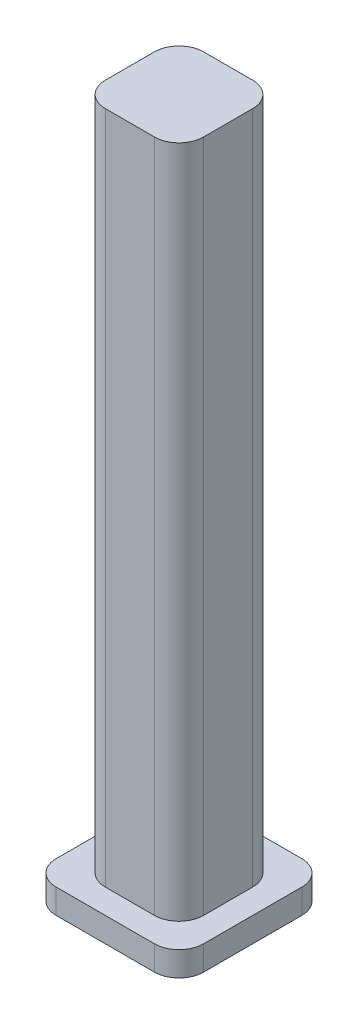
ISO-10303-21;
HEADER;
FILE_DESCRIPTION(('STEP AP214'),'2;1');
FILE_NAME('part.step','',(''),(''),'','','');
FILE_SCHEMA(('AUTOMOTIVE_DESIGN { 1 0 10303 214 1 1 1 1 }'));
ENDSEC;
DATA;
#1=APPLICATION_CONTEXT('core data for automotive mechanical design processes');
#2=APPLICATION_PROTOCOL_DEFINITION('international standard','automotive_design',2000,#1);
#3=PRODUCT_CONTEXT('',#1,'mechanical');
#4=PRODUCT('Part','Part','',(#3));
#5=PRODUCT_RELATED_PRODUCT_CATEGORY('part','',(#4));
#6=PRODUCT_DEFINITION_FORMATION('','',#4);
#7=PRODUCT_DEFINITION_CONTEXT('part definition',#1,'design');
#8=PRODUCT_DEFINITION('design','',#6,#7);
#9=PRODUCT_DEFINITION_SHAPE('','',#8);
#10=(LENGTH_UNIT() NAMED_UNIT(*) SI_UNIT(.MILLI.,.METRE.));
#11=(NAMED_UNIT(*) PLANE_ANGLE_UNIT() SI_UNIT($,.RADIAN.));
#12=(NAMED_UNIT(*) SI_UNIT($,.STERADIAN.) SOLID_ANGLE_UNIT());
#13=UNCERTAINTY_MEASURE_WITH_UNIT(LENGTH_MEASURE(1.E-05),#10,'distance_accuracy_value','');
#14=(GEOMETRIC_REPRESENTATION_CONTEXT(3) GLOBAL_UNCERTAINTY_ASSIGNED_CONTEXT((#13)) GLOBAL_UNIT_ASSIGNED_CONTEXT((#10,
#11,#12)) REPRESENTATION_CONTEXT('',''));
#15=CARTESIAN_POINT('',(0.,0.,0.));
#16=DIRECTION('',(0.,0.,1.));
#17=DIRECTION('',(1.,0.,0.));
#18=AXIS2_PLACEMENT_3D('',#15,#16,#17);
#19=CARTESIAN_POINT('',(0.,10.,0.));
#20=DIRECTION('',(0.,-1.,0.));
#21=DIRECTION('',(0.,0.,-1.));
#22=AXIS2_PLACEMENT_3D('',#19,#20,#21);
#23=PLANE('',#22);
#24=DIRECTION('',(0.,0.,-1.));
#25=VECTOR('',#24,1.);
#26=CARTESIAN_POINT('',(30.,10.,30.));
#27=LINE('',#26,#25);
#28=CARTESIAN_POINT('',(30.,10.,20.));
#29=VERTEX_POINT('',#28);
#30=CARTESIAN_POINT('',(30.,10.,-20.));
#31=VERTEX_POINT('',#30);
#32=EDGE_CURVE('E189',#29,#31,#27,.T.);
#33=ORIENTED_EDGE('',*,*,#32,.T.);
#34=CARTESIAN_POINT('',(20.,10.,-20.));
#35=DIRECTION('',(0.,-1.,0.));
#36=DIRECTION('',(0.,0.,-1.));
#37=AXIS2_PLACEMENT_3D('',#34,#35,#36);
#38=CIRCLE('',#37,10.);
#39=CARTESIAN_POINT('',(20.,10.,-30.));
#40=VERTEX_POINT('',#39);
#41=EDGE_CURVE('E205',#31,#40,#38,.F.);
#42=ORIENTED_EDGE('',*,*,#41,.T.);
#43=DIRECTION('',(-1.,0.,0.));
#44=VECTOR('',#43,1.);
#45=CARTESIAN_POINT('',(-30.,10.,-30.));
#46=LINE('',#45,#44);
#47=CARTESIAN_POINT('',(-20.,10.,-30.));
#48=VERTEX_POINT('',#47);
#49=EDGE_CURVE('E171',#40,#48,#46,.T.);
#50=ORIENTED_EDGE('',*,*,#49,.T.);
#51=CARTESIAN_POINT('',(-20.,10.,-20.));
#52=DIRECTION('',(0.,-1.,0.));
#53=DIRECTION('',(0.,0.,-1.));
#54=AXIS2_PLACEMENT_3D('',#51,#52,#53);
#55=CIRCLE('',#54,10.);
#56=CARTESIAN_POINT('',(-30.,10.,-20.));
#57=VERTEX_POINT('',#56);
#58=EDGE_CURVE('E203',#48,#57,#55,.F.);
#59=ORIENTED_EDGE('',*,*,#58,.T.);
#60=DIRECTION('',(0.,0.,1.));
#61=VECTOR('',#60,1.);
#62=CARTESIAN_POINT('',(-30.,10.,30.));
#63=LINE('',#62,#61);
#64=CARTESIAN_POINT('',(-30.,10.,20.));
#65=VERTEX_POINT('',#64);
#66=EDGE_CURVE('E288',#57,#65,#63,.T.);
#67=ORIENTED_EDGE('',*,*,#66,.T.);
#68=CARTESIAN_POINT('',(-20.,10.,20.));
#69=DIRECTION('',(0.,-1.,0.));
#70=DIRECTION('',(0.,0.,-1.));
#71=AXIS2_PLACEMENT_3D('',#68,#69,#70);
#72=CIRCLE('',#71,10.);
#73=CARTESIAN_POINT('',(-20.,10.,30.));
#74=VERTEX_POINT('',#73);
#75=EDGE_CURVE('E201',#65,#74,#72,.F.);
#76=ORIENTED_EDGE('',*,*,#75,.T.);
#77=DIRECTION('',(1.,0.,0.));
#78=VECTOR('',#77,1.);
#79=CARTESIAN_POINT('',(-30.,10.,30.));
#80=LINE('',#79,#78);
#81=CARTESIAN_POINT('',(20.,10.,30.));
#82=VERTEX_POINT('',#81);
#83=EDGE_CURVE('E190',#74,#82,#80,.T.);
#84=ORIENTED_EDGE('',*,*,#83,.T.);
#85=CARTESIAN_POINT('',(20.,10.,20.));
#86=DIRECTION('',(0.,-1.,0.));
#87=DIRECTION('',(0.,0.,-1.));
#88=AXIS2_PLACEMENT_3D('',#85,#86,#87);
#89=CIRCLE('',#88,10.);
#90=EDGE_CURVE('E199',#82,#29,#89,.F.);
#91=ORIENTED_EDGE('',*,*,#90,.T.);
#92=EDGE_LOOP('',(#33,#42,#50,#59,#67,#76,#84,#91));
#93=FACE_BOUND('',#92,.T.);
#94=DIRECTION('',(0.,0.,-1.));
#95=VECTOR('',#94,1.);
#96=CARTESIAN_POINT('',(20.,10.,0.));
#97=LINE('',#96,#95);
#98=CARTESIAN_POINT('',(20.,10.,10.));
#99=VERTEX_POINT('',#98);
#100=CARTESIAN_POINT('',(20.,10.,-10.));
#101=VERTEX_POINT('',#100);
#102=EDGE_CURVE('E183',#99,#101,#97,.T.);
#103=ORIENTED_EDGE('',*,*,#102,.F.);
#104=CARTESIAN_POINT('',(10.,10.,10.));
#105=DIRECTION('',(0.,-1.,0.));
#106=DIRECTION('',(0.,0.,-1.));
#107=AXIS2_PLACEMENT_3D('',#104,#105,#106);
#108=CIRCLE('',#107,10.);
#109=CARTESIAN_POINT('',(10.,10.,20.));
#110=VERTEX_POINT('',#109);
#111=EDGE_CURVE('E245',#99,#110,#108,.T.);
#112=ORIENTED_EDGE('',*,*,#111,.T.);
#113=DIRECTION('',(1.,0.,0.));
#114=VECTOR('',#113,1.);
#115=CARTESIAN_POINT('',(0.,10.,20.));
#116=LINE('',#115,#114);
#117=CARTESIAN_POINT('',(-10.,10.,20.));
#118=VERTEX_POINT('',#117);
#119=EDGE_CURVE('E275',#118,#110,#116,.T.);
#120=ORIENTED_EDGE('',*,*,#119,.F.);
#121=CARTESIAN_POINT('',(-10.,10.,10.));
#122=DIRECTION('',(0.,-1.,0.));
#123=DIRECTION('',(0.,0.,-1.));
#124=AXIS2_PLACEMENT_3D('',#121,#122,#123);
#125=CIRCLE('',#124,10.);
#126=CARTESIAN_POINT('',(-20.,10.,10.));
#127=VERTEX_POINT('',#126);
#128=EDGE_CURVE('E11',#118,#127,#125,.T.);
#129=ORIENTED_EDGE('',*,*,#128,.T.);
#130=DIRECTION('',(0.,0.,1.));
#131=VECTOR('',#130,1.);
#132=CARTESIAN_POINT('',(-20.,10.,0.));
#133=LINE('',#132,#131);
#134=CARTESIAN_POINT('',(-20.,10.,-9.99999999999999));
#135=VERTEX_POINT('',#134);
#136=EDGE_CURVE('E253',#135,#127,#133,.T.);
#137=ORIENTED_EDGE('',*,*,#136,.F.);
#138=CARTESIAN_POINT('',(-10.,10.,-9.99999999999999));
#139=DIRECTION('',(0.,-1.,0.));
#140=DIRECTION('',(0.,0.,-1.));
#141=AXIS2_PLACEMENT_3D('',#138,#139,#140);
#142=CIRCLE('',#141,10.);
#143=CARTESIAN_POINT('',(-10.,10.,-20.));
#144=VERTEX_POINT('',#143);
#145=EDGE_CURVE('E45',#135,#144,#142,.T.);
#146=ORIENTED_EDGE('',*,*,#145,.T.);
#147=DIRECTION('',(-1.,0.,0.));
#148=VECTOR('',#147,1.);
#149=CARTESIAN_POINT('',(0.,10.,-20.));
#150=LINE('',#149,#148);
#151=CARTESIAN_POINT('',(9.99999999999999,10.,-20.));
#152=VERTEX_POINT('',#151);
#153=EDGE_CURVE('E251',#152,#144,#150,.T.);
#154=ORIENTED_EDGE('',*,*,#153,.F.);
#155=CARTESIAN_POINT('',(9.99999999999999,10.,-10.));
#156=DIRECTION('',(0.,-1.,0.));
#157=DIRECTION('',(0.,0.,-1.));
#158=AXIS2_PLACEMENT_3D('',#155,#156,#157);
#159=CIRCLE('',#158,10.);
#160=EDGE_CURVE('E243',#152,#101,#159,.T.);
#161=ORIENTED_EDGE('',*,*,#160,.T.);
#162=EDGE_LOOP('',(#103,#112,#120,#129,#137,#146,#154,#161));
#163=FACE_BOUND('',#162,.T.);
#164=ADVANCED_FACE('F37',(#93,#163),#23,.F.);
#165=CARTESIAN_POINT('',(30.,10.,30.));
#166=DIRECTION('',(-1.,0.,0.));
#167=DIRECTION('',(0.,0.,1.));
#168=AXIS2_PLACEMENT_3D('',#165,#166,#167);
#169=PLANE('',#168);
#170=DIRECTION('',(0.,0.,-1.));
#171=VECTOR('',#170,1.);
#172=CARTESIAN_POINT('',(30.,0.,30.));
#173=LINE('',#172,#171);
#174=CARTESIAN_POINT('',(30.,0.,20.));
#175=VERTEX_POINT('',#174);
#176=CARTESIAN_POINT('',(30.,0.,-20.));
#177=VERTEX_POINT('',#176);
#178=EDGE_CURVE('E178',#175,#177,#173,.T.);
#179=ORIENTED_EDGE('',*,*,#178,.T.);
#180=DIRECTION('',(0.,-1.,0.));
#181=VECTOR('',#180,1.);
#182=CARTESIAN_POINT('',(30.,10.,-20.));
#183=LINE('',#182,#181);
#184=EDGE_CURVE('E156',#177,#31,#183,.F.);
#185=ORIENTED_EDGE('',*,*,#184,.T.);
#186=ORIENTED_EDGE('',*,*,#32,.F.);
#187=DIRECTION('',(0.,-1.,0.));
#188=VECTOR('',#187,1.);
#189=CARTESIAN_POINT('',(30.,10.,20.));
#190=LINE('',#189,#188);
#191=EDGE_CURVE('E161',#29,#175,#190,.T.);
#192=ORIENTED_EDGE('',*,*,#191,.T.);
#193=EDGE_LOOP('',(#179,#185,#186,#192));
#194=FACE_BOUND('',#193,.T.);
#195=ADVANCED_FACE('F303',(#194),#169,.F.);
#196=CARTESIAN_POINT('',(-30.,10.,-30.));
#197=DIRECTION('',(0.,0.,1.));
#198=DIRECTION('',(1.,0.,0.));
#199=AXIS2_PLACEMENT_3D('',#196,#197,#198);
#200=PLANE('',#199);
#201=ORIENTED_EDGE('',*,*,#49,.F.);
#202=DIRECTION('',(0.,-1.,0.));
#203=VECTOR('',#202,1.);
#204=CARTESIAN_POINT('',(20.,10.,-30.));
#205=LINE('',#204,#203);
#206=CARTESIAN_POINT('',(20.,0.,-30.));
#207=VERTEX_POINT('',#206);
#208=EDGE_CURVE('E155',#40,#207,#205,.T.);
#209=ORIENTED_EDGE('',*,*,#208,.T.);
#210=DIRECTION('',(-1.,0.,0.));
#211=VECTOR('',#210,1.);
#212=CARTESIAN_POINT('',(-30.,0.,-30.));
#213=LINE('',#212,#211);
#214=CARTESIAN_POINT('',(-20.,0.,-30.));
#215=VERTEX_POINT('',#214);
#216=EDGE_CURVE('E168',#207,#215,#213,.T.);
#217=ORIENTED_EDGE('',*,*,#216,.T.);
#218=DIRECTION('',(0.,-1.,0.));
#219=VECTOR('',#218,1.);
#220=CARTESIAN_POINT('',(-20.,10.,-30.));
#221=LINE('',#220,#219);
#222=EDGE_CURVE('E173',#215,#48,#221,.F.);
#223=ORIENTED_EDGE('',*,*,#222,.T.);
#224=EDGE_LOOP('',(#201,#209,#217,#223));
#225=FACE_BOUND('',#224,.T.);
#226=ADVANCED_FACE('F167',(#225),#200,.F.);
#227=CARTESIAN_POINT('',(-30.,10.,30.));
#228=DIRECTION('',(1.,0.,0.));
#229=DIRECTION('',(0.,0.,-1.));
#230=AXIS2_PLACEMENT_3D('',#227,#228,#229);
#231=PLANE('',#230);
#232=ORIENTED_EDGE('',*,*,#66,.F.);
#233=DIRECTION('',(0.,-1.,0.));
#234=VECTOR('',#233,1.);
#235=CARTESIAN_POINT('',(-30.,10.,-20.));
#236=LINE('',#235,#234);
#237=CARTESIAN_POINT('',(-30.,0.,-20.));
#238=VERTEX_POINT('',#237);
#239=EDGE_CURVE('E209',#57,#238,#236,.T.);
#240=ORIENTED_EDGE('',*,*,#239,.T.);
#241=DIRECTION('',(0.,0.,1.));
#242=VECTOR('',#241,1.);
#243=CARTESIAN_POINT('',(-30.,0.,30.));
#244=LINE('',#243,#242);
#245=CARTESIAN_POINT('',(-30.,0.,20.));
#246=VERTEX_POINT('',#245);
#247=EDGE_CURVE('E177',#238,#246,#244,.T.);
#248=ORIENTED_EDGE('',*,*,#247,.T.);
#249=DIRECTION('',(0.,-1.,0.));
#250=VECTOR('',#249,1.);
#251=CARTESIAN_POINT('',(-30.,10.,20.));
#252=LINE('',#251,#250);
#253=EDGE_CURVE('E207',#246,#65,#252,.F.);
#254=ORIENTED_EDGE('',*,*,#253,.T.);
#255=EDGE_LOOP('',(#232,#240,#248,#254));
#256=FACE_BOUND('',#255,.T.);
#257=ADVANCED_FACE('F311',(#256),#231,.F.);
#258=CARTESIAN_POINT('',(-30.,10.,30.));
#259=DIRECTION('',(0.,0.,-1.));
#260=DIRECTION('',(-1.,0.,0.));
#261=AXIS2_PLACEMENT_3D('',#258,#259,#260);
#262=PLANE('',#261);
#263=ORIENTED_EDGE('',*,*,#83,.F.);
#264=DIRECTION('',(0.,-1.,0.));
#265=VECTOR('',#264,1.);
#266=CARTESIAN_POINT('',(-20.,10.,30.));
#267=LINE('',#266,#265);
#268=CARTESIAN_POINT('',(-20.,0.,30.));
#269=VERTEX_POINT('',#268);
#270=EDGE_CURVE('E214',#74,#269,#267,.T.);
#271=ORIENTED_EDGE('',*,*,#270,.T.);
#272=DIRECTION('',(1.,0.,0.));
#273=VECTOR('',#272,1.);
#274=CARTESIAN_POINT('',(-30.,0.,30.));
#275=LINE('',#274,#273);
#276=CARTESIAN_POINT('',(20.,0.,30.));
#277=VERTEX_POINT('',#276);
#278=EDGE_CURVE('E181',#269,#277,#275,.T.);
#279=ORIENTED_EDGE('',*,*,#278,.T.);
#280=DIRECTION('',(0.,-1.,0.));
#281=VECTOR('',#280,1.);
#282=CARTESIAN_POINT('',(20.,10.,30.));
#283=LINE('',#282,#281);
#284=EDGE_CURVE('E212',#277,#82,#283,.F.);
#285=ORIENTED_EDGE('',*,*,#284,.T.);
#286=EDGE_LOOP('',(#263,#271,#279,#285));
#287=FACE_BOUND('',#286,.T.);
#288=ADVANCED_FACE('F305',(#287),#262,.F.);
#289=CARTESIAN_POINT('',(0.,0.,0.));
#290=DIRECTION('',(0.,-1.,0.));
#291=DIRECTION('',(0.,0.,-1.));
#292=AXIS2_PLACEMENT_3D('',#289,#290,#291);
#293=PLANE('',#292);
#294=ORIENTED_EDGE('',*,*,#216,.F.);
#295=CARTESIAN_POINT('',(20.,0.,-20.));
#296=DIRECTION('',(0.,-1.,0.));
#297=DIRECTION('',(0.,0.,-1.));
#298=AXIS2_PLACEMENT_3D('',#295,#296,#297);
#299=CIRCLE('',#298,10.);
#300=EDGE_CURVE('E151',#207,#177,#299,.T.);
#301=ORIENTED_EDGE('',*,*,#300,.T.);
#302=ORIENTED_EDGE('',*,*,#178,.F.);
#303=CARTESIAN_POINT('',(20.,0.,20.));
#304=DIRECTION('',(0.,-1.,0.));
#305=DIRECTION('',(0.,0.,-1.));
#306=AXIS2_PLACEMENT_3D('',#303,#304,#305);
#307=CIRCLE('',#306,10.);
#308=EDGE_CURVE('E172',#175,#277,#307,.T.);
#309=ORIENTED_EDGE('',*,*,#308,.T.);
#310=ORIENTED_EDGE('',*,*,#278,.F.);
#311=CARTESIAN_POINT('',(-20.,0.,20.));
#312=DIRECTION('',(0.,-1.,0.));
#313=DIRECTION('',(0.,0.,-1.));
#314=AXIS2_PLACEMENT_3D('',#311,#312,#313);
#315=CIRCLE('',#314,10.);
#316=EDGE_CURVE('E193',#269,#246,#315,.T.);
#317=ORIENTED_EDGE('',*,*,#316,.T.);
#318=ORIENTED_EDGE('',*,*,#247,.F.);
#319=CARTESIAN_POINT('',(-20.,0.,-20.));
#320=DIRECTION('',(0.,-1.,0.));
#321=DIRECTION('',(0.,0.,-1.));
#322=AXIS2_PLACEMENT_3D('',#319,#320,#321);
#323=CIRCLE('',#322,10.);
#324=EDGE_CURVE('E162',#238,#215,#323,.T.);
#325=ORIENTED_EDGE('',*,*,#324,.T.);
#326=EDGE_LOOP('',(#294,#301,#302,#309,#310,#317,#318,#325));
#327=FACE_BOUND('',#326,.T.);
#328=ADVANCED_FACE('F175',(#327),#293,.T.);
#329=CARTESIAN_POINT('',(20.,284.35549,20.));
#330=DIRECTION('',(-1.,0.,0.));
#331=DIRECTION('',(0.,0.,1.));
#332=AXIS2_PLACEMENT_3D('',#329,#330,#331);
#333=PLANE('',#332);
#334=ORIENTED_EDGE('',*,*,#102,.T.);
#335=DIRECTION('',(0.,-1.,0.));
#336=VECTOR('',#335,1.);
#337=CARTESIAN_POINT('',(20.,284.35549,-9.99999999999999));
#338=LINE('',#337,#336);
#339=CARTESIAN_POINT('',(20.,284.35549,-9.99999999999999));
#340=VERTEX_POINT('',#339);
#341=EDGE_CURVE('E225',#101,#340,#338,.F.);
#342=ORIENTED_EDGE('',*,*,#341,.T.);
#343=DIRECTION('',(0.,0.,-1.));
#344=VECTOR('',#343,1.);
#345=CARTESIAN_POINT('',(20.,284.35549,20.));
#346=LINE('',#345,#344);
#347=CARTESIAN_POINT('',(20.,284.35549,10.));
#348=VERTEX_POINT('',#347);
#349=EDGE_CURVE('E277',#348,#340,#346,.T.);
#350=ORIENTED_EDGE('',*,*,#349,.F.);
#351=DIRECTION('',(0.,-1.,0.));
#352=VECTOR('',#351,1.);
#353=CARTESIAN_POINT('',(20.,284.35549,10.));
#354=LINE('',#353,#352);
#355=EDGE_CURVE('E222',#348,#99,#354,.T.);
#356=ORIENTED_EDGE('',*,*,#355,.T.);
#357=EDGE_LOOP('',(#334,#342,#350,#356));
#358=FACE_BOUND('',#357,.T.);
#359=ADVANCED_FACE('F332',(#358),#333,.F.);
#360=CARTESIAN_POINT('',(-20.,284.35549,-20.));
#361=DIRECTION('',(0.,0.,1.));
#362=DIRECTION('',(1.,0.,0.));
#363=AXIS2_PLACEMENT_3D('',#360,#361,#362);
#364=PLANE('',#363);
#365=DIRECTION('',(-1.,0.,0.));
#366=VECTOR('',#365,1.);
#367=CARTESIAN_POINT('',(-20.,284.35549,-20.));
#368=LINE('',#367,#366);
#369=CARTESIAN_POINT('',(9.99999999999999,284.35549,-20.));
#370=VERTEX_POINT('',#369);
#371=CARTESIAN_POINT('',(-10.,284.35549,-20.));
#372=VERTEX_POINT('',#371);
#373=EDGE_CURVE('E269',#370,#372,#368,.T.);
#374=ORIENTED_EDGE('',*,*,#373,.F.);
#375=DIRECTION('',(0.,-1.,0.));
#376=VECTOR('',#375,1.);
#377=CARTESIAN_POINT('',(9.99999999999999,284.35549,-20.));
#378=LINE('',#377,#376);
#379=EDGE_CURVE('E219',#370,#152,#378,.T.);
#380=ORIENTED_EDGE('',*,*,#379,.T.);
#381=ORIENTED_EDGE('',*,*,#153,.T.);
#382=DIRECTION('',(0.,-1.,0.));
#383=VECTOR('',#382,1.);
#384=CARTESIAN_POINT('',(-10.,284.35549,-20.));
#385=LINE('',#384,#383);
#386=EDGE_CURVE('E217',#144,#372,#385,.F.);
#387=ORIENTED_EDGE('',*,*,#386,.T.);
#388=EDGE_LOOP('',(#374,#380,#381,#387));
#389=FACE_BOUND('',#388,.T.);
#390=ADVANCED_FACE('F259',(#389),#364,.F.);
#391=CARTESIAN_POINT('',(-20.,284.35549,20.));
#392=DIRECTION('',(1.,0.,0.));
#393=DIRECTION('',(0.,0.,-1.));
#394=AXIS2_PLACEMENT_3D('',#391,#392,#393);
#395=PLANE('',#394);
#396=DIRECTION('',(0.,0.,1.));
#397=VECTOR('',#396,1.);
#398=CARTESIAN_POINT('',(-20.,284.35549,20.));
#399=LINE('',#398,#397);
#400=CARTESIAN_POINT('',(-20.,284.35549,-9.99999999999999));
#401=VERTEX_POINT('',#400);
#402=CARTESIAN_POINT('',(-20.,284.35549,10.));
#403=VERTEX_POINT('',#402);
#404=EDGE_CURVE('E268',#401,#403,#399,.T.);
#405=ORIENTED_EDGE('',*,*,#404,.F.);
#406=DIRECTION('',(0.,-1.,0.));
#407=VECTOR('',#406,1.);
#408=CARTESIAN_POINT('',(-20.,284.35549,-9.99999999999999));
#409=LINE('',#408,#407);
#410=EDGE_CURVE('E240',#401,#135,#409,.T.);
#411=ORIENTED_EDGE('',*,*,#410,.T.);
#412=ORIENTED_EDGE('',*,*,#136,.T.);
#413=DIRECTION('',(0.,-1.,0.));
#414=VECTOR('',#413,1.);
#415=CARTESIAN_POINT('',(-20.,284.35549,10.));
#416=LINE('',#415,#414);
#417=EDGE_CURVE('E238',#127,#403,#416,.F.);
#418=ORIENTED_EDGE('',*,*,#417,.T.);
#419=EDGE_LOOP('',(#405,#411,#412,#418));
#420=FACE_BOUND('',#419,.T.);
#421=ADVANCED_FACE('F271',(#420),#395,.F.);
#422=CARTESIAN_POINT('',(-20.,284.35549,20.));
#423=DIRECTION('',(0.,0.,-1.));
#424=DIRECTION('',(-1.,0.,0.));
#425=AXIS2_PLACEMENT_3D('',#422,#423,#424);
#426=PLANE('',#425);
#427=ORIENTED_EDGE('',*,*,#119,.T.);
#428=DIRECTION('',(0.,-1.,0.));
#429=VECTOR('',#428,1.);
#430=CARTESIAN_POINT('',(9.99999999999999,284.35549,20.));
#431=LINE('',#430,#429);
#432=CARTESIAN_POINT('',(9.99999999999999,284.35549,20.));
#433=VERTEX_POINT('',#432);
#434=EDGE_CURVE('E52',#110,#433,#431,.F.);
#435=ORIENTED_EDGE('',*,*,#434,.T.);
#436=DIRECTION('',(1.,0.,0.));
#437=VECTOR('',#436,1.);
#438=CARTESIAN_POINT('',(-20.,284.35549,20.));
#439=LINE('',#438,#437);
#440=CARTESIAN_POINT('',(-10.,284.35549,20.));
#441=VERTEX_POINT('',#440);
#442=EDGE_CURVE('E273',#441,#433,#439,.T.);
#443=ORIENTED_EDGE('',*,*,#442,.F.);
#444=DIRECTION('',(0.,-1.,0.));
#445=VECTOR('',#444,1.);
#446=CARTESIAN_POINT('',(-10.,284.35549,20.));
#447=LINE('',#446,#445);
#448=EDGE_CURVE('E234',#441,#118,#447,.T.);
#449=ORIENTED_EDGE('',*,*,#448,.T.);
#450=EDGE_LOOP('',(#427,#435,#443,#449));
#451=FACE_BOUND('',#450,.T.);
#452=ADVANCED_FACE('F374',(#451),#426,.F.);
#453=CARTESIAN_POINT('',(0.,284.35549,0.));
#454=DIRECTION('',(0.,-1.,0.));
#455=DIRECTION('',(0.,0.,-1.));
#456=AXIS2_PLACEMENT_3D('',#453,#454,#455);
#457=PLANE('',#456);
#458=ORIENTED_EDGE('',*,*,#349,.T.);
#459=CARTESIAN_POINT('',(9.99999999999999,284.35549,-10.));
#460=DIRECTION('',(0.,-1.,0.));
#461=DIRECTION('',(0.,0.,-1.));
#462=AXIS2_PLACEMENT_3D('',#459,#460,#461);
#463=CIRCLE('',#462,10.);
#464=EDGE_CURVE('E232',#340,#370,#463,.F.);
#465=ORIENTED_EDGE('',*,*,#464,.T.);
#466=ORIENTED_EDGE('',*,*,#373,.T.);
#467=CARTESIAN_POINT('',(-10.,284.35549,-9.99999999999999));
#468=DIRECTION('',(0.,-1.,0.));
#469=DIRECTION('',(0.,0.,-1.));
#470=AXIS2_PLACEMENT_3D('',#467,#468,#469);
#471=CIRCLE('',#470,10.);
#472=EDGE_CURVE('E228',#372,#401,#471,.F.);
#473=ORIENTED_EDGE('',*,*,#472,.T.);
#474=ORIENTED_EDGE('',*,*,#404,.T.);
#475=CARTESIAN_POINT('',(-10.,284.35549,10.));
#476=DIRECTION('',(0.,-1.,0.));
#477=DIRECTION('',(0.,0.,-1.));
#478=AXIS2_PLACEMENT_3D('',#475,#476,#477);
#479=CIRCLE('',#478,10.);
#480=EDGE_CURVE('E59',#403,#441,#479,.F.);
#481=ORIENTED_EDGE('',*,*,#480,.T.);
#482=ORIENTED_EDGE('',*,*,#442,.T.);
#483=CARTESIAN_POINT('',(10.,284.35549,10.));
#484=DIRECTION('',(0.,-1.,0.));
#485=DIRECTION('',(0.,0.,-1.));
#486=AXIS2_PLACEMENT_3D('',#483,#484,#485);
#487=CIRCLE('',#486,10.);
#488=EDGE_CURVE('E230',#433,#348,#487,.F.);
#489=ORIENTED_EDGE('',*,*,#488,.T.);
#490=EDGE_LOOP('',(#458,#465,#466,#473,#474,#481,#482,#489));
#491=FACE_BOUND('',#490,.T.);
#492=ADVANCED_FACE('F267',(#491),#457,.F.);
#493=CARTESIAN_POINT('',(20.,10.,-20.));
#494=DIRECTION('',(0.,-1.,0.));
#495=DIRECTION('',(0.,0.,-1.));
#496=AXIS2_PLACEMENT_3D('',#493,#494,#495);
#497=CYLINDRICAL_SURFACE('',#496,10.);
#498=ORIENTED_EDGE('',*,*,#41,.F.);
#499=ORIENTED_EDGE('',*,*,#184,.F.);
#500=ORIENTED_EDGE('',*,*,#300,.F.);
#501=ORIENTED_EDGE('',*,*,#208,.F.);
#502=EDGE_LOOP('',(#498,#499,#500,#501));
#503=FACE_BOUND('',#502,.T.);
#504=ADVANCED_FACE('F154',(#503),#497,.T.);
#505=CARTESIAN_POINT('',(-20.,10.,-20.));
#506=DIRECTION('',(0.,-1.,0.));
#507=DIRECTION('',(0.,0.,-1.));
#508=AXIS2_PLACEMENT_3D('',#505,#506,#507);
#509=CYLINDRICAL_SURFACE('',#508,10.);
#510=ORIENTED_EDGE('',*,*,#58,.F.);
#511=ORIENTED_EDGE('',*,*,#222,.F.);
#512=ORIENTED_EDGE('',*,*,#324,.F.);
#513=ORIENTED_EDGE('',*,*,#239,.F.);
#514=EDGE_LOOP('',(#510,#511,#512,#513));
#515=FACE_BOUND('',#514,.T.);
#516=ADVANCED_FACE('F315',(#515),#509,.T.);
#517=CARTESIAN_POINT('',(-20.,10.,20.));
#518=DIRECTION('',(0.,-1.,0.));
#519=DIRECTION('',(0.,0.,-1.));
#520=AXIS2_PLACEMENT_3D('',#517,#518,#519);
#521=CYLINDRICAL_SURFACE('',#520,10.);
#522=ORIENTED_EDGE('',*,*,#75,.F.);
#523=ORIENTED_EDGE('',*,*,#253,.F.);
#524=ORIENTED_EDGE('',*,*,#316,.F.);
#525=ORIENTED_EDGE('',*,*,#270,.F.);
#526=EDGE_LOOP('',(#522,#523,#524,#525));
#527=FACE_BOUND('',#526,.T.);
#528=ADVANCED_FACE('F307',(#527),#521,.T.);
#529=CARTESIAN_POINT('',(20.,10.,20.));
#530=DIRECTION('',(0.,-1.,0.));
#531=DIRECTION('',(0.,0.,-1.));
#532=AXIS2_PLACEMENT_3D('',#529,#530,#531);
#533=CYLINDRICAL_SURFACE('',#532,10.);
#534=ORIENTED_EDGE('',*,*,#90,.F.);
#535=ORIENTED_EDGE('',*,*,#284,.F.);
#536=ORIENTED_EDGE('',*,*,#308,.F.);
#537=ORIENTED_EDGE('',*,*,#191,.F.);
#538=EDGE_LOOP('',(#534,#535,#536,#537));
#539=FACE_BOUND('',#538,.T.);
#540=ADVANCED_FACE('F301',(#539),#533,.T.);
#541=CARTESIAN_POINT('',(9.99999999999999,284.35549,-10.));
#542=DIRECTION('',(0.,-1.,0.));
#543=DIRECTION('',(0.,0.,-1.));
#544=AXIS2_PLACEMENT_3D('',#541,#542,#543);
#545=CYLINDRICAL_SURFACE('',#544,10.);
#546=ORIENTED_EDGE('',*,*,#464,.F.);
#547=ORIENTED_EDGE('',*,*,#341,.F.);
#548=ORIENTED_EDGE('',*,*,#160,.F.);
#549=ORIENTED_EDGE('',*,*,#379,.F.);
#550=EDGE_LOOP('',(#546,#547,#548,#549));
#551=FACE_BOUND('',#550,.T.);
#552=ADVANCED_FACE('F413',(#551),#545,.T.);
#553=CARTESIAN_POINT('',(10.,284.35549,10.));
#554=DIRECTION('',(0.,-1.,0.));
#555=DIRECTION('',(0.,0.,-1.));
#556=AXIS2_PLACEMENT_3D('',#553,#554,#555);
#557=CYLINDRICAL_SURFACE('',#556,10.);
#558=ORIENTED_EDGE('',*,*,#488,.F.);
#559=ORIENTED_EDGE('',*,*,#434,.F.);
#560=ORIENTED_EDGE('',*,*,#111,.F.);
#561=ORIENTED_EDGE('',*,*,#355,.F.);
#562=EDGE_LOOP('',(#558,#559,#560,#561));
#563=FACE_BOUND('',#562,.T.);
#564=ADVANCED_FACE('F423',(#563),#557,.T.);
#565=CARTESIAN_POINT('',(-10.,284.35549,-9.99999999999999));
#566=DIRECTION('',(0.,-1.,0.));
#567=DIRECTION('',(0.,0.,-1.));
#568=AXIS2_PLACEMENT_3D('',#565,#566,#567);
#569=CYLINDRICAL_SURFACE('',#568,10.);
#570=ORIENTED_EDGE('',*,*,#472,.F.);
#571=ORIENTED_EDGE('',*,*,#386,.F.);
#572=ORIENTED_EDGE('',*,*,#145,.F.);
#573=ORIENTED_EDGE('',*,*,#410,.F.);
#574=EDGE_LOOP('',(#570,#571,#572,#573));
#575=FACE_BOUND('',#574,.T.);
#576=ADVANCED_FACE('F264',(#575),#569,.T.);
#577=CARTESIAN_POINT('',(-10.,284.35549,10.));
#578=DIRECTION('',(0.,-1.,0.));
#579=DIRECTION('',(0.,0.,-1.));
#580=AXIS2_PLACEMENT_3D('',#577,#578,#579);
#581=CYLINDRICAL_SURFACE('',#580,10.);
#582=ORIENTED_EDGE('',*,*,#480,.F.);
#583=ORIENTED_EDGE('',*,*,#417,.F.);
#584=ORIENTED_EDGE('',*,*,#128,.F.);
#585=ORIENTED_EDGE('',*,*,#448,.F.);
#586=EDGE_LOOP('',(#582,#583,#584,#585));
#587=FACE_BOUND('',#586,.T.);
#588=ADVANCED_FACE('F39',(#587),#581,.T.);
#589=CLOSED_SHELL('',(#164,#195,#226,#257,#288,#328,#359,#390,#421,#452,#492,#504,#516,#528,
#540,#552,#564,#576,#588));
#590=MANIFOLD_SOLID_BREP('B2',#589);
#591=ADVANCED_BREP_SHAPE_REPRESENTATION('',(#18,#590),#14);
#592=SHAPE_DEFINITION_REPRESENTATION(#9,#591);
ENDSEC;
END-ISO-10303-21;
